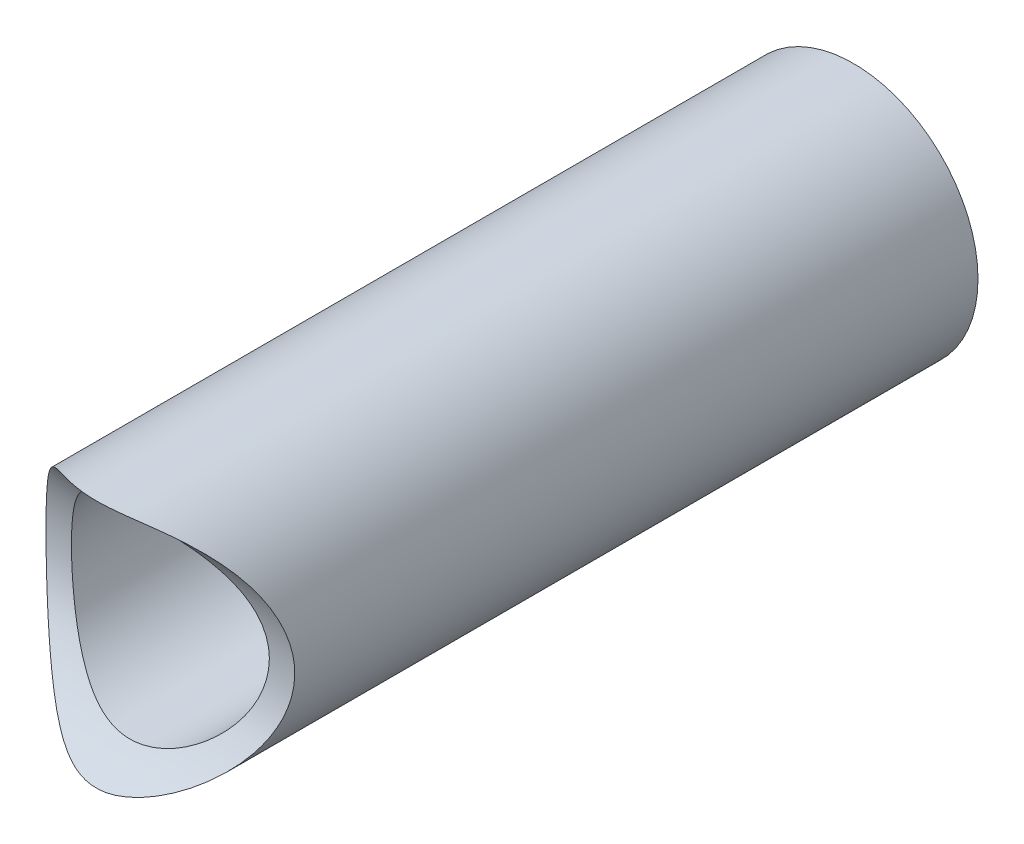
ISO-10303-21;
HEADER;
FILE_DESCRIPTION(('STEP AP214'),'2;1');
FILE_NAME('part.step','',(''),(''),'','','');
FILE_SCHEMA(('AUTOMOTIVE_DESIGN { 1 0 10303 214 1 1 1 1 }'));
ENDSEC;
DATA;
#1=APPLICATION_CONTEXT('core data for automotive mechanical design processes');
#2=APPLICATION_PROTOCOL_DEFINITION('international standard','automotive_design',2000,#1);
#3=PRODUCT_CONTEXT('',#1,'mechanical');
#4=PRODUCT('Part','Part','',(#3));
#5=PRODUCT_RELATED_PRODUCT_CATEGORY('part','',(#4));
#6=PRODUCT_DEFINITION_FORMATION('','',#4);
#7=PRODUCT_DEFINITION_CONTEXT('part definition',#1,'design');
#8=PRODUCT_DEFINITION('design','',#6,#7);
#9=PRODUCT_DEFINITION_SHAPE('','',#8);
#10=(LENGTH_UNIT() NAMED_UNIT(*) SI_UNIT(.MILLI.,.METRE.));
#11=(NAMED_UNIT(*) PLANE_ANGLE_UNIT() SI_UNIT($,.RADIAN.));
#12=(NAMED_UNIT(*) SI_UNIT($,.STERADIAN.) SOLID_ANGLE_UNIT());
#13=UNCERTAINTY_MEASURE_WITH_UNIT(LENGTH_MEASURE(1.E-05),#10,'distance_accuracy_value','');
#14=(GEOMETRIC_REPRESENTATION_CONTEXT(3) GLOBAL_UNCERTAINTY_ASSIGNED_CONTEXT((#13)) GLOBAL_UNIT_ASSIGNED_CONTEXT((#10,
#11,#12)) REPRESENTATION_CONTEXT('',''));
#15=CARTESIAN_POINT('',(0.,0.,0.));
#16=DIRECTION('',(0.,0.,1.));
#17=DIRECTION('',(1.,0.,0.));
#18=AXIS2_PLACEMENT_3D('',#15,#16,#17);
#19=CARTESIAN_POINT('',(-16.764,0.,55.5625));
#20=DIRECTION('',(1.,0.,0.));
#21=DIRECTION('',(0.,1.,0.));
#22=AXIS2_PLACEMENT_3D('',#19,#20,#21);
#23=CYLINDRICAL_SURFACE('',#22,19.05);
#24=CARTESIAN_POINT('',(-16.764,0.,36.5125));
#25=CARTESIAN_POINT('',(-16.7640054844861,0.39139730942897,36.5124945813317));
#26=CARTESIAN_POINT('',(-16.7502734230084,0.78273680027755,36.5245825700416));
#27=CARTESIAN_POINT('',(-16.6956257305327,1.56217551972862,36.5726461807048));
#28=CARTESIAN_POINT('',(-16.6547016279179,1.95027370034154,36.6086292471114));
#29=CARTESIAN_POINT('',(-16.5463873139127,2.72032341176663,36.703733673084));
#30=CARTESIAN_POINT('',(-16.4789660032711,3.10226716890006,36.7628822212361));
#31=CARTESIAN_POINT('',(-16.3188963039278,3.85668476922253,36.903033594525));
#32=CARTESIAN_POINT('',(-16.2262492809356,4.2291591238878,36.984035236542));
#33=CARTESIAN_POINT('',(-16.0179510137251,4.95987440751327,37.1656802004901));
#34=CARTESIAN_POINT('',(-15.9024545047754,5.31819261731891,37.2661913234364));
#35=CARTESIAN_POINT('',(-15.6497624921902,6.02131295287309,37.4853896260594));
#36=CARTESIAN_POINT('',(-15.5125671660242,6.36611518913684,37.6040766570793));
#37=CARTESIAN_POINT('',(-15.2182027200028,7.04084442938859,37.8577289562082));
#38=CARTESIAN_POINT('',(-15.0610336122564,7.37077144239454,37.9926942144487));
#39=CARTESIAN_POINT('',(-14.7283825839439,8.0148538849354,38.2769972470671));
#40=CARTESIAN_POINT('',(-14.5528966104928,8.32900580111868,38.4263382017156));
#41=CARTESIAN_POINT('',(-14.1135863944062,9.06003756388114,38.7980868612807));
#42=CARTESIAN_POINT('',(-13.8419655902768,9.46930460739496,39.0263080929029));
#43=CARTESIAN_POINT('',(-13.270074368657,10.2554025738446,39.5019754050165));
#44=CARTESIAN_POINT('',(-12.9697936052195,10.6322216893299,39.74942842195));
#45=CARTESIAN_POINT('',(-12.3428676026689,11.3540460202597,40.259433754209));
#46=CARTESIAN_POINT('',(-12.0161638044063,11.6989767289146,40.522019214675));
#47=CARTESIAN_POINT('',(-11.3392026544145,12.3562439428633,41.0571459104997));
#48=CARTESIAN_POINT('',(-10.9889484509778,12.668584790683,41.3296858129009));
#49=CARTESIAN_POINT('',(-10.258200717814,13.2675973415175,41.8860946867955));
#50=CARTESIAN_POINT('',(-9.87721216442799,13.5535550571456,42.170081019931));
#51=CARTESIAN_POINT('',(-9.09219677797624,14.0922096896172,42.7380982049038));
#52=CARTESIAN_POINT('',(-8.68816290234574,14.3448963600563,43.0221290436102));
#53=CARTESIAN_POINT('',(-7.85723173716265,14.8163227632379,43.5828118228584));
#54=CARTESIAN_POINT('',(-7.43037957276275,15.0351263885835,43.8594768163004));
#55=CARTESIAN_POINT('',(-6.55138478119362,15.4384203281427,44.3969213234689));
#56=CARTESIAN_POINT('',(-6.09926118947797,15.6229360281505,44.657712492744));
#57=CARTESIAN_POINT('',(-5.39455814231206,15.8743298028289,45.0301002190666));
#58=CARTESIAN_POINT('',(-5.15238434302998,15.9546446081769,45.1523487810798));
#59=CARTESIAN_POINT('',(-4.66030599367574,16.1052663768937,45.386925396429));
#60=CARTESIAN_POINT('',(-4.41040112573988,16.1755729281046,45.4992530411314));
#61=CARTESIAN_POINT('',(-3.64908065172765,16.3703821316077,45.8170135281076));
#62=CARTESIAN_POINT('',(-3.12500711959367,16.4791562521724,46.0038052022338));
#63=CARTESIAN_POINT('',(-2.3600033455141,16.5986397878643,46.2140836216776));
#64=CARTESIAN_POINT('',(-2.1307625558452,16.6296684210884,46.26951376082));
#65=CARTESIAN_POINT('',(-1.6680115163756,16.682432978121,46.364572242488));
#66=CARTESIAN_POINT('',(-1.43450346495192,16.7041735535718,46.4042084942326));
#67=CARTESIAN_POINT('',(-0.964776280329246,16.7378694582023,46.4659357368013));
#68=CARTESIAN_POINT('',(-0.728561178459716,16.7498377998946,46.4880500583138));
#69=CARTESIAN_POINT('',(-0.254815706410914,16.7637378658403,46.5137535849874));
#70=CARTESIAN_POINT('',(-0.0172853544773878,16.7656697289769,46.5173430464925));
#71=CARTESIAN_POINT('',(0.457388465501336,16.7594416549323,46.5058087967156));
#72=CARTESIAN_POINT('',(0.694531412615337,16.7512728790473,46.4906686958655));
#73=CARTESIAN_POINT('',(1.16640476395944,16.7250426372729,46.442401788368));
#74=CARTESIAN_POINT('',(1.40113509716281,16.7069808809817,46.4092744537177));
#75=CARTESIAN_POINT('',(1.86708039642655,16.6613506877042,46.3264773758986));
#76=CARTESIAN_POINT('',(2.09828904349684,16.6337668794688,46.2767808899562));
#77=CARTESIAN_POINT('',(2.55584952098467,16.5696332212917,46.1628178093404));
#78=CARTESIAN_POINT('',(2.78219955123602,16.533080108427,46.0985459129578));
#79=CARTESIAN_POINT('',(3.35762150815613,16.4282054728797,45.9171424132188));
#80=CARTESIAN_POINT('',(3.70267882895301,16.3536833556349,45.7908271082948));
#81=CARTESIAN_POINT('',(4.3787247075996,16.1857957600185,45.5151845493678));
#82=CARTESIAN_POINT('',(4.70970382853596,16.0924178759123,45.3658421605779));
#83=CARTESIAN_POINT('',(5.35919121739291,15.8879532572602,45.050081020631));
#84=CARTESIAN_POINT('',(5.6776518282396,15.7768057379897,44.8836043808783));
#85=CARTESIAN_POINT('',(6.30177053089732,15.5380505437266,44.5390967530644));
#86=CARTESIAN_POINT('',(6.6074299141519,15.4104445344629,44.3610669351806));
#87=CARTESIAN_POINT('',(7.1554149889794,15.1626495981367,44.0285549654064));
#88=CARTESIAN_POINT('',(7.3996060949168,15.0449472337159,43.875276233152));
#89=CARTESIAN_POINT('',(7.88025319681457,14.7988575509142,43.5651862794328));
#90=CARTESIAN_POINT('',(8.11670831545398,14.6704690264513,43.4083746606931));
#91=CARTESIAN_POINT('',(8.81513278520011,14.2693295043139,42.9347646575168));
#92=CARTESIAN_POINT('',(9.26601143824315,13.9806726387727,42.6148841651108));
#93=CARTESIAN_POINT('',(10.1384229841536,13.3615055691721,41.9768293736144));
#94=CARTESIAN_POINT('',(10.5599804439379,13.0310310731197,41.6586538574576));
#95=CARTESIAN_POINT('',(11.3731942648836,12.3276485328023,41.0313787827209));
#96=CARTESIAN_POINT('',(11.7648639518994,11.9547595864722,40.722275217573));
#97=CARTESIAN_POINT('',(12.4346001367814,11.2514174271904,40.185265753471));
#98=CARTESIAN_POINT('',(12.718906576194,10.9292480250436,39.9542658452051));
#99=CARTESIAN_POINT('',(13.2659128666432,10.258388523744,39.5053894151826));
#100=CARTESIAN_POINT('',(13.5286128327063,9.90969856579826,39.2875128235627));
#101=CARTESIAN_POINT('',(14.0297432602722,9.18647366244573,38.8686199459552));
#102=CARTESIAN_POINT('',(14.2682034680756,8.81197136435147,38.6675830494706));
#103=CARTESIAN_POINT('',(14.7184001231168,8.03746768578073,38.2856975944553));
#104=CARTESIAN_POINT('',(14.930142941795,7.63747241912669,38.1048442238429));
#105=CARTESIAN_POINT('',(15.2852740467478,6.89398710918225,37.8000728485269));
#106=CARTESIAN_POINT('',(15.4339330061349,6.55473665330571,37.6719360256148));
#107=CARTESIAN_POINT('',(15.7101704316789,5.86184923320539,37.433091806895));
#108=CARTESIAN_POINT('',(15.8377532736422,5.50821527432151,37.3223807933807));
#109=CARTESIAN_POINT('',(16.0699482096872,4.78864689145758,37.1204078509041));
#110=CARTESIAN_POINT('',(16.1745935235463,4.42273115308434,37.0291178008284));
#111=CARTESIAN_POINT('',(16.3594896175105,3.68036814061739,36.8675357165914));
#112=CARTESIAN_POINT('',(16.4397477841335,3.30392409319819,36.797237324469));
#113=CARTESIAN_POINT('',(16.5918605422337,2.44493943243533,36.6638504490648));
#114=CARTESIAN_POINT('',(16.6562405502888,1.96002022472188,36.6072701775727));
#115=CARTESIAN_POINT('',(16.7423107881715,0.983371098501145,36.5315948847026));
#116=CARTESIAN_POINT('',(16.7639931108561,0.491639935470647,36.5125068064692));
#117=CARTESIAN_POINT('',(16.7640054844861,-0.391397309428968,36.5124945813317));
#118=CARTESIAN_POINT('',(16.7502734230084,-0.78273680027755,36.5245825700416));
#119=CARTESIAN_POINT('',(16.6956257305327,-1.56217551972862,36.5726461807048));
#120=CARTESIAN_POINT('',(16.6547016279179,-1.95027370034154,36.6086292471114));
#121=CARTESIAN_POINT('',(16.5463873139127,-2.72032341176663,36.703733673084));
#122=CARTESIAN_POINT('',(16.4789660032711,-3.10226716890006,36.7628822212361));
#123=CARTESIAN_POINT('',(16.3188963039278,-3.85668476922253,36.903033594525));
#124=CARTESIAN_POINT('',(16.2262492809356,-4.2291591238878,36.9840352365421));
#125=CARTESIAN_POINT('',(16.0179510137251,-4.95987440751327,37.1656802004901));
#126=CARTESIAN_POINT('',(15.9024545047754,-5.31819261731891,37.2661913234365));
#127=CARTESIAN_POINT('',(15.6497624921902,-6.02131295287309,37.4853896260594));
#128=CARTESIAN_POINT('',(15.5125671660242,-6.36611518913684,37.6040766570793));
#129=CARTESIAN_POINT('',(15.2182027200028,-7.04084442938859,37.8577289562082));
#130=CARTESIAN_POINT('',(15.0610336122564,-7.37077144239454,37.9926942144487));
#131=CARTESIAN_POINT('',(14.7283825839439,-8.01485388493539,38.2769972470671));
#132=CARTESIAN_POINT('',(14.5528966104928,-8.32900580111867,38.4263382017156));
#133=CARTESIAN_POINT('',(14.1135863944062,-9.06003756388114,38.7980868612807));
#134=CARTESIAN_POINT('',(13.8419655902768,-9.46930460739496,39.026308092903));
#135=CARTESIAN_POINT('',(13.270074368657,-10.2554025738446,39.5019754050165));
#136=CARTESIAN_POINT('',(12.9697936052195,-10.6322216893299,39.74942842195));
#137=CARTESIAN_POINT('',(12.3428676026689,-11.3540460202597,40.259433754209));
#138=CARTESIAN_POINT('',(12.0161638044063,-11.6989767289146,40.522019214675));
#139=CARTESIAN_POINT('',(11.3392026544145,-12.3562439428633,41.0571459104997));
#140=CARTESIAN_POINT('',(10.9889484509778,-12.668584790683,41.3296858129009));
#141=CARTESIAN_POINT('',(10.258200717814,-13.2675973415174,41.8860946867955));
#142=CARTESIAN_POINT('',(9.87721216442798,-13.5535550571456,42.170081019931));
#143=CARTESIAN_POINT('',(9.09219677797624,-14.0922096896172,42.7380982049038));
#144=CARTESIAN_POINT('',(8.68816290234574,-14.3448963600564,43.0221290436102));
#145=CARTESIAN_POINT('',(7.85723173716264,-14.8163227632379,43.5828118228584));
#146=CARTESIAN_POINT('',(7.43037957276274,-15.0351263885835,43.8594768163004));
#147=CARTESIAN_POINT('',(6.55138478119362,-15.4384203281427,44.3969213234689));
#148=CARTESIAN_POINT('',(6.09926118947798,-15.6229360281505,44.657712492744));
#149=CARTESIAN_POINT('',(5.39455814231207,-15.8743298028289,45.0301002190666));
#150=CARTESIAN_POINT('',(5.15238434302999,-15.9546446081769,45.1523487810798));
#151=CARTESIAN_POINT('',(4.66030599367575,-16.1052663768937,45.386925396429));
#152=CARTESIAN_POINT('',(4.41040112573989,-16.1755729281046,45.4992530411314));
#153=CARTESIAN_POINT('',(3.64908065172766,-16.3703821316077,45.8170135281077));
#154=CARTESIAN_POINT('',(3.12500711959367,-16.4791562521724,46.0038052022338));
#155=CARTESIAN_POINT('',(2.36000334551411,-16.5986397878643,46.2140836216776));
#156=CARTESIAN_POINT('',(2.13076255584521,-16.6296684210884,46.26951376082));
#157=CARTESIAN_POINT('',(1.66801151637561,-16.682432978121,46.364572242488));
#158=CARTESIAN_POINT('',(1.43450346495193,-16.7041735535718,46.4042084942326));
#159=CARTESIAN_POINT('',(0.964776280329263,-16.7378694582023,46.4659357368013));
#160=CARTESIAN_POINT('',(0.72856117845973,-16.7498377998946,46.4880500583138));
#161=CARTESIAN_POINT('',(0.254815706410926,-16.7637378658403,46.5137535849874));
#162=CARTESIAN_POINT('',(0.0172853544773994,-16.7656697289769,46.5173430464926));
#163=CARTESIAN_POINT('',(-0.457388465501328,-16.7594416549323,46.5058087967156));
#164=CARTESIAN_POINT('',(-0.694531412615333,-16.7512728790473,46.4906686958655));
#165=CARTESIAN_POINT('',(-1.16640476395944,-16.7250426372729,46.442401788368));
#166=CARTESIAN_POINT('',(-1.4011350971628,-16.7069808809817,46.4092744537177));
#167=CARTESIAN_POINT('',(-1.86708039642654,-16.6613506877042,46.3264773758987));
#168=CARTESIAN_POINT('',(-2.09828904349684,-16.6337668794688,46.2767808899563));
#169=CARTESIAN_POINT('',(-2.55584952098466,-16.5696332212917,46.1628178093404));
#170=CARTESIAN_POINT('',(-2.78219955123601,-16.533080108427,46.0985459129579));
#171=CARTESIAN_POINT('',(-3.35762150815611,-16.4282054728797,45.9171424132188));
#172=CARTESIAN_POINT('',(-3.702678828953,-16.3536833556349,45.7908271082949));
#173=CARTESIAN_POINT('',(-4.37872470759958,-16.1857957600185,45.5151845493678));
#174=CARTESIAN_POINT('',(-4.70970382853594,-16.0924178759123,45.3658421605779));
#175=CARTESIAN_POINT('',(-5.35919121739289,-15.8879532572602,45.0500810206311));
#176=CARTESIAN_POINT('',(-5.67765182823959,-15.7768057379897,44.8836043808783));
#177=CARTESIAN_POINT('',(-6.30177053089731,-15.5380505437266,44.5390967530644));
#178=CARTESIAN_POINT('',(-6.60742991415188,-15.4104445344629,44.3610669351806));
#179=CARTESIAN_POINT('',(-7.15541498897938,-15.1626495981368,44.0285549654064));
#180=CARTESIAN_POINT('',(-7.39960609491679,-15.0449472337159,43.875276233152));
#181=CARTESIAN_POINT('',(-7.88025319681455,-14.7988575509143,43.5651862794328));
#182=CARTESIAN_POINT('',(-8.11670831545397,-14.6704690264513,43.4083746606931));
#183=CARTESIAN_POINT('',(-8.81513278520009,-14.2693295043139,42.9347646575168));
#184=CARTESIAN_POINT('',(-9.26601143824314,-13.9806726387727,42.6148841651108));
#185=CARTESIAN_POINT('',(-10.1384229841536,-13.3615055691721,41.9768293736145));
#186=CARTESIAN_POINT('',(-10.5599804439379,-13.0310310731197,41.6586538574576));
#187=CARTESIAN_POINT('',(-11.3731942648836,-12.3276485328023,41.0313787827209));
#188=CARTESIAN_POINT('',(-11.7648639518994,-11.9547595864722,40.722275217573));
#189=CARTESIAN_POINT('',(-12.4346001367813,-11.2514174271905,40.185265753471));
#190=CARTESIAN_POINT('',(-12.718906576194,-10.9292480250436,39.9542658452052));
#191=CARTESIAN_POINT('',(-13.2659128666432,-10.258388523744,39.5053894151826));
#192=CARTESIAN_POINT('',(-13.5286128327063,-9.90969856579828,39.2875128235627));
#193=CARTESIAN_POINT('',(-14.0297432602722,-9.18647366244574,38.8686199459552));
#194=CARTESIAN_POINT('',(-14.2682034680756,-8.81197136435149,38.6675830494707));
#195=CARTESIAN_POINT('',(-14.7184001231168,-8.03746768578074,38.2856975944554));
#196=CARTESIAN_POINT('',(-14.930142941795,-7.63747241912671,38.1048442238429));
#197=CARTESIAN_POINT('',(-15.2852740467478,-6.89398710918227,37.8000728485269));
#198=CARTESIAN_POINT('',(-15.4339330061349,-6.55473665330573,37.6719360256148));
#199=CARTESIAN_POINT('',(-15.7101704316789,-5.8618492332054,37.433091806895));
#200=CARTESIAN_POINT('',(-15.8377532736422,-5.50821527432152,37.3223807933807));
#201=CARTESIAN_POINT('',(-16.0699482096872,-4.7886468914576,37.1204078509041));
#202=CARTESIAN_POINT('',(-16.1745935235463,-4.42273115308435,37.0291178008284));
#203=CARTESIAN_POINT('',(-16.3594896175105,-3.68036814061741,36.8675357165914));
#204=CARTESIAN_POINT('',(-16.4397477841335,-3.30392409319821,36.797237324469));
#205=CARTESIAN_POINT('',(-16.5918605422337,-2.44493943243535,36.6638504490648));
#206=CARTESIAN_POINT('',(-16.6562405502888,-1.96002022472189,36.6072701775727));
#207=CARTESIAN_POINT('',(-16.7423107881715,-0.983371098501147,36.5315948847026));
#208=CARTESIAN_POINT('',(-16.7639931108561,-0.491639935470646,36.5125068064692));
#209=CARTESIAN_POINT('',(-16.764,0.,36.5125));
#210=B_SPLINE_CURVE_WITH_KNOTS('',3,(#24,#25,#26,#27,#28,#29,#30,#31,#32,#33,#34,#35,#36,#37,
#38,#39,#40,#41,#42,#43,#44,#45,#46,#47,#48,#49,#50,#51,#52,#53,#54,#55,#56,#57,#58,#59,#60,#61,
#62,#63,#64,#65,#66,#67,#68,#69,#70,#71,#72,#73,#74,#75,#76,#77,#78,#79,#80,#81,#82,#83,#84,#85,
#86,#87,#88,#89,#90,#91,#92,#93,#94,#95,#96,#97,#98,#99,#100,#101,#102,#103,#104,#105,#106,#107,
#108,#109,#110,#111,#112,#113,#114,#115,#116,#117,#118,#119,#120,#121,#122,#123,#124,#125,#126,
#127,#128,#129,#130,#131,#132,#133,#134,#135,#136,#137,#138,#139,#140,#141,#142,#143,#144,#145,
#146,#147,#148,#149,#150,#151,#152,#153,#154,#155,#156,#157,#158,#159,#160,#161,#162,#163,#164,
#165,#166,#167,#168,#169,#170,#171,#172,#173,#174,#175,#176,#177,#178,#179,#180,#181,#182,#183,
#184,#185,#186,#187,#188,#189,#190,#191,#192,#193,#194,#195,#196,#197,#198,#199,#200,#201,#202,
#203,#204,#205,#206,#207,#208,#209),.UNSPECIFIED.,.T.,.F.,(4,2,2,2,2,2,2,2,2,2,2,2,2,2,2,2,2,2,
2,2,2,2,2,2,2,2,2,2,2,2,2,2,2,2,2,2,2,2,2,2,2,2,2,2,2,2,2,2,2,2,2,2,2,2,2,2,2,2,2,2,2,2,2,2,2,2,
2,2,2,2,2,2,2,2,2,2,2,2,2,2,2,2,2,2,2,2,2,2,2,2,2,2,4),(0.,1.17366938123894,2.34770458797881,
3.523121871657,4.69847553138196,5.86612660471153,7.03376812858978,8.20140894458896,
9.36930866876286,10.9918195004091,12.614918272965,14.2417183032403,15.8683012884927,
17.5305903747246,19.1933902007111,20.8530153001715,22.5114067222628,23.3597307967524,
24.2080897966516,25.9010449101967,26.6141008166743,27.3267991908789,28.0385469952419,
28.7502849505304,29.4626461629635,30.1750282874027,30.8885658150781,31.6023633047983,
32.7252553830502,33.8488886646121,34.9764512122882,36.1038997311761,37.0378230516306,
37.9718519216566,39.8404749405956,41.7075129787961,43.5737136498739,45.0359915995116,
46.498261763895,47.9587152434052,49.4188197797639,50.5934966901756,51.7679294077689,
52.9406498212808,54.113014679688,55.5870051658314,57.0612685931861,58.2349379744251,
59.408973181165,60.5843904648431,61.7597441245681,62.9273951978977,64.0950367217759,
65.2626775377751,66.430577261949,68.0530880935953,69.6761868661511,71.3029868964264,
72.9295698816788,74.5918589679107,76.2546587938972,77.9142838933576,79.5726753154489,
80.4209993899385,81.2693583898378,82.9623135033828,83.6753694098605,84.3880677840651,
85.099815588428,85.8115535437166,86.5239147561497,87.2362968805888,87.9498344082643,
88.6636318979845,89.7865239762363,90.9101572577982,92.0377198054744,93.1651683243623,
94.0990916448167,95.0331205148428,96.9017435337817,98.7687815719823,100.63498224306,
102.097260192698,103.559530357081,105.019983836591,106.48008837295,107.654765283362,
108.829198000955,110.001918414467,111.174283272874,112.648273759018,114.122537186372),.UNSPECIFIED.);
#211=CARTESIAN_POINT('',(-16.764,0.,36.5125));
#212=VERTEX_POINT('',#211);
#213=EDGE_CURVE('E23',#212,#212,#210,.T.);
#214=ORIENTED_EDGE('',*,*,#213,.F.);
#215=EDGE_LOOP('',(#214));
#216=FACE_BOUND('',#215,.T.);
#217=CARTESIAN_POINT('',(13.335,0.,36.5125));
#218=CARTESIAN_POINT('',(13.3349998310996,-0.331214006662135,36.5125001606869));
#219=CARTESIAN_POINT('',(13.3226427833964,-0.662430379972625,36.5211561860425));
#220=CARTESIAN_POINT('',(13.2734073009387,-1.32226605422439,36.5555721043265));
#221=CARTESIAN_POINT('',(13.2365188451218,-1.65088423827268,36.5813389870213));
#222=CARTESIAN_POINT('',(13.1387220509647,-2.30329936426253,36.6494077239953));
#223=CARTESIAN_POINT('',(13.0777765314928,-2.62708803426037,36.6917351723782));
#224=CARTESIAN_POINT('',(12.9327849510489,-3.26694211170769,36.7919257356523));
#225=CARTESIAN_POINT('',(12.8487409067431,-3.58300819077254,36.8497874942772));
#226=CARTESIAN_POINT('',(12.6592170975991,-4.20371008478648,36.9794081656126));
#227=CARTESIAN_POINT('',(12.5538580546709,-4.50839930583791,37.0510887096387));
#228=CARTESIAN_POINT('',(12.3226717804494,-5.10654548667596,37.2070855979078));
#229=CARTESIAN_POINT('',(12.1968441695972,-5.40000223804853,37.291402176465));
#230=CARTESIAN_POINT('',(11.9260705808903,-5.97426186786242,37.4710330613262));
#231=CARTESIAN_POINT('',(11.781133057736,-6.25507026896431,37.5663425017931));
#232=CARTESIAN_POINT('',(11.4732920140314,-6.80328393844191,37.766348472144));
#233=CARTESIAN_POINT('',(11.3103818256876,-7.07068417856313,37.8710484831832));
#234=CARTESIAN_POINT('',(10.9526684852804,-7.61421443705744,38.097666582422));
#235=CARTESIAN_POINT('',(10.756319601426,-7.88903315496674,38.2202887827578));
#236=CARTESIAN_POINT('',(10.3450726659631,-8.42109082920582,38.4723157788924));
#237=CARTESIAN_POINT('',(10.1301740190812,-8.67832922089698,38.6017207923036));
#238=CARTESIAN_POINT('',(9.68257063367653,-9.17507520534563,38.8652051308582));
#239=CARTESIAN_POINT('',(9.44983864279871,-9.41455451438904,38.9992914324668));
#240=CARTESIAN_POINT('',(8.96779865598274,-9.87480878074935,39.2694996616376));
#241=CARTESIAN_POINT('',(8.71849408369825,-10.0955875800185,39.405621164281));
#242=CARTESIAN_POINT('',(8.15852830623948,-10.5552832588468,39.7013607720932));
#243=CARTESIAN_POINT('',(7.84479901762021,-10.7905350661877,39.8608901803219));
#244=CARTESIAN_POINT('',(7.19596479816822,-11.2336408287707,40.1747921014021));
#245=CARTESIAN_POINT('',(6.8608543535791,-11.4414876741207,40.3291632682841));
#246=CARTESIAN_POINT('',(6.17042176409874,-11.8281221846384,40.6273886918586));
#247=CARTESIAN_POINT('',(5.81512641249453,-12.0069472101947,40.7712563364904));
#248=CARTESIAN_POINT('',(5.08485125467672,-12.3339522599415,41.0428137400705));
#249=CARTESIAN_POINT('',(4.70988194714212,-12.4821484243073,41.1705120058168));
#250=CARTESIAN_POINT('',(4.06150662275521,-12.7045073996557,41.3669847158969));
#251=CARTESIAN_POINT('',(3.79285973637347,-12.7873501324856,41.4417212080728));
#252=CARTESIAN_POINT('',(3.24783219070956,-12.9365212172016,41.578253568734));
#253=CARTESIAN_POINT('',(2.97145386216519,-13.0028544876395,41.6400532905094));
#254=CARTESIAN_POINT('',(2.41260904071702,-13.1180330721688,41.7485224079218));
#255=CARTESIAN_POINT('',(2.13015314602492,-13.1669065675404,41.7952161740018));
#256=CARTESIAN_POINT('',(1.56041079404798,-13.2465111932256,41.8717911422238));
#257=CARTESIAN_POINT('',(1.27312434761947,-13.2772423643074,41.9016723821456));
#258=CARTESIAN_POINT('',(0.694155913978656,-13.3201016958579,41.9434579490931));
#259=CARTESIAN_POINT('',(0.40245807703037,-13.3321205680373,41.9552566597636));
#260=CARTESIAN_POINT('',(-0.181251300365104,-13.3369620476428,41.9600018399201));
#261=CARTESIAN_POINT('',(-0.473262839649987,-13.3297847259497,41.9529483790164));
#262=CARTESIAN_POINT('',(-1.05531063509338,-13.2963746511409,41.9203060473015));
#263=CARTESIAN_POINT('',(-1.3453456004487,-13.2701304631805,41.8947060537276));
#264=CARTESIAN_POINT('',(-1.92102454000492,-13.1990917790176,41.8260921894121));
#265=CARTESIAN_POINT('',(-2.20666842282074,-13.1542968972877,41.7830779567616));
#266=CARTESIAN_POINT('',(-2.75293211401949,-13.0505046901703,41.6847637992091));
#267=CARTESIAN_POINT('',(-3.01395316933309,-12.9926494008912,41.6304706275814));
#268=CARTESIAN_POINT('',(-3.52949877768456,-12.862178710381,41.5099289044254));
#269=CARTESIAN_POINT('',(-3.78402090501314,-12.7895578860386,41.4436759612969));
#270=CARTESIAN_POINT('',(-4.53671445638378,-12.5505957500511,41.2296465621945));
#271=CARTESIAN_POINT('',(-5.02404498698402,-12.363148575814,41.0665934016235));
#272=CARTESIAN_POINT('',(-5.85475066123838,-11.9875223799871,40.755522913561));
#273=CARTESIAN_POINT('',(-6.20509107438044,-11.8098162886531,40.6129415437968));
#274=CARTESIAN_POINT('',(-6.88584733133273,-11.4262813094221,40.3177913113794));
#275=CARTESIAN_POINT('',(-7.21625495061505,-11.2204409258094,40.165218379501));
#276=CARTESIAN_POINT('',(-7.85682760653754,-10.7816290421719,39.8548154988196));
#277=CARTESIAN_POINT('',(-8.1669558801132,-10.5486102900442,39.6969767454439));
#278=CARTESIAN_POINT('',(-8.7655595028778,-10.0567002588419,39.3806961086577));
#279=CARTESIAN_POINT('',(-9.05403765086052,-9.79781233409636,39.2222543059977));
#280=CARTESIAN_POINT('',(-9.61159741992512,-9.25167554501496,38.9068819301783));
#281=CARTESIAN_POINT('',(-9.8804082345447,-8.96412657715668,38.7499916040065));
#282=CARTESIAN_POINT('',(-10.3933081084284,-8.36403909727233,38.4435381307309));
#283=CARTESIAN_POINT('',(-10.6373947046992,-8.05149810111279,38.2939757143884));
#284=CARTESIAN_POINT('',(-11.0985135680546,-7.40292495288257,38.0061652287347));
#285=CARTESIAN_POINT('',(-11.3155856374938,-7.06692852739921,37.8679006193423));
#286=CARTESIAN_POINT('',(-11.7207137247781,-6.37248409984463,37.6061219984507));
#287=CARTESIAN_POINT('',(-11.9087791706917,-6.01404344634029,37.4826031970606));
#288=CARTESIAN_POINT('',(-12.2153076329885,-5.35808779881927,37.2790658151983));
#289=CARTESIAN_POINT('',(-12.339973797294,-5.06456907552826,37.1954612791157));
#290=CARTESIAN_POINT('',(-12.5688335095926,-4.46644443655993,37.0409255529209));
#291=CARTESIAN_POINT('',(-12.6730312027857,-4.1618407806033,36.969991797033));
#292=CARTESIAN_POINT('',(-12.8595568947654,-3.54373158148091,36.8423541169374));
#293=CARTESIAN_POINT('',(-12.9419256853341,-3.23024387152182,36.7856236620777));
#294=CARTESIAN_POINT('',(-13.0839230460293,-2.59591248066319,36.6874719745261));
#295=CARTESIAN_POINT('',(-13.1435602868023,-2.2750716541173,36.6460449047485));
#296=CARTESIAN_POINT('',(-13.2390185821769,-1.62985280601078,36.5795940483614));
#297=CARTESIAN_POINT('',(-13.2749587623445,-1.30550093902369,36.5544882236335));
#298=CARTESIAN_POINT('',(-13.3229520975901,-0.65410052339235,36.5209393462468));
#299=CARTESIAN_POINT('',(-13.3350001667777,-0.327051415463977,36.5124998413326));
#300=CARTESIAN_POINT('',(-13.3349998310996,0.331214006662137,36.5125001606869));
#301=CARTESIAN_POINT('',(-13.3226427833964,0.662430379972627,36.5211561860425));
#302=CARTESIAN_POINT('',(-13.2734073009387,1.32226605422439,36.5555721043265));
#303=CARTESIAN_POINT('',(-13.2365188451218,1.65088423827268,36.5813389870213));
#304=CARTESIAN_POINT('',(-13.1387220509647,2.30329936426253,36.6494077239953));
#305=CARTESIAN_POINT('',(-13.0777765314928,2.62708803426038,36.6917351723782));
#306=CARTESIAN_POINT('',(-12.9327849510489,3.2669421117077,36.7919257356523));
#307=CARTESIAN_POINT('',(-12.8487409067431,3.58300819077254,36.8497874942772));
#308=CARTESIAN_POINT('',(-12.6592170975991,4.20371008478648,36.9794081656126));
#309=CARTESIAN_POINT('',(-12.5538580546709,4.50839930583792,37.0510887096387));
#310=CARTESIAN_POINT('',(-12.3226717804494,5.10654548667597,37.2070855979078));
#311=CARTESIAN_POINT('',(-12.1968441695972,5.40000223804854,37.291402176465));
#312=CARTESIAN_POINT('',(-11.9260705808903,5.97426186786242,37.4710330613262));
#313=CARTESIAN_POINT('',(-11.781133057736,6.25507026896431,37.5663425017931));
#314=CARTESIAN_POINT('',(-11.4732920140314,6.80328393844191,37.766348472144));
#315=CARTESIAN_POINT('',(-11.3103818256876,7.07068417856313,37.8710484831832));
#316=CARTESIAN_POINT('',(-10.9526684852804,7.61421443705744,38.097666582422));
#317=CARTESIAN_POINT('',(-10.756319601426,7.88903315496674,38.2202887827578));
#318=CARTESIAN_POINT('',(-10.3450726659631,8.42109082920582,38.4723157788924));
#319=CARTESIAN_POINT('',(-10.1301740190812,8.67832922089699,38.6017207923036));
#320=CARTESIAN_POINT('',(-9.68257063367653,9.17507520534564,38.8652051308582));
#321=CARTESIAN_POINT('',(-9.4498386427987,9.41455451438905,38.9992914324668));
#322=CARTESIAN_POINT('',(-8.96779865598274,9.87480878074935,39.2694996616376));
#323=CARTESIAN_POINT('',(-8.71849408369824,10.0955875800185,39.405621164281));
#324=CARTESIAN_POINT('',(-8.15852830623948,10.5552832588468,39.7013607720932));
#325=CARTESIAN_POINT('',(-7.8447990176202,10.7905350661877,39.8608901803219));
#326=CARTESIAN_POINT('',(-7.19596479816821,11.2336408287707,40.1747921014021));
#327=CARTESIAN_POINT('',(-6.86085435357909,11.4414876741207,40.3291632682841));
#328=CARTESIAN_POINT('',(-6.17042176409874,11.8281221846384,40.6273886918586));
#329=CARTESIAN_POINT('',(-5.81512641249452,12.0069472101947,40.7712563364904));
#330=CARTESIAN_POINT('',(-5.08485125467672,12.3339522599415,41.0428137400705));
#331=CARTESIAN_POINT('',(-4.70988194714212,12.4821484243073,41.1705120058168));
#332=CARTESIAN_POINT('',(-4.06150662275521,12.7045073996557,41.3669847158969));
#333=CARTESIAN_POINT('',(-3.79285973637346,12.7873501324856,41.4417212080728));
#334=CARTESIAN_POINT('',(-3.24783219070955,12.9365212172016,41.578253568734));
#335=CARTESIAN_POINT('',(-2.97145386216519,13.0028544876395,41.6400532905093));
#336=CARTESIAN_POINT('',(-2.41260904071702,13.1180330721688,41.7485224079218));
#337=CARTESIAN_POINT('',(-2.13015314602492,13.1669065675404,41.7952161740017));
#338=CARTESIAN_POINT('',(-1.56041079404798,13.2465111932256,41.8717911422237));
#339=CARTESIAN_POINT('',(-1.27312434761947,13.2772423643074,41.9016723821456));
#340=CARTESIAN_POINT('',(-0.694155913978652,13.3201016958579,41.9434579490931));
#341=CARTESIAN_POINT('',(-0.402458077030366,13.3321205680373,41.9552566597636));
#342=CARTESIAN_POINT('',(0.181251300365107,13.3369620476428,41.9600018399201));
#343=CARTESIAN_POINT('',(0.47326283964999,13.3297847259497,41.9529483790164));
#344=CARTESIAN_POINT('',(1.05531063509338,13.2963746511409,41.9203060473015));
#345=CARTESIAN_POINT('',(1.34534560044871,13.2701304631805,41.8947060537276));
#346=CARTESIAN_POINT('',(1.92102454000493,13.1990917790176,41.8260921894121));
#347=CARTESIAN_POINT('',(2.20666842282075,13.1542968972877,41.7830779567616));
#348=CARTESIAN_POINT('',(2.75293211401949,13.0505046901703,41.6847637992091));
#349=CARTESIAN_POINT('',(3.0139531693331,12.9926494008911,41.6304706275814));
#350=CARTESIAN_POINT('',(3.52949877768457,12.862178710381,41.5099289044254));
#351=CARTESIAN_POINT('',(3.78402090501315,12.7895578860386,41.4436759612969));
#352=CARTESIAN_POINT('',(4.53671445638379,12.5505957500511,41.2296465621944));
#353=CARTESIAN_POINT('',(5.02404498698403,12.363148575814,41.0665934016235));
#354=CARTESIAN_POINT('',(5.85475066123838,11.9875223799871,40.755522913561));
#355=CARTESIAN_POINT('',(6.20509107438045,11.8098162886531,40.6129415437968));
#356=CARTESIAN_POINT('',(6.88584733133274,11.4262813094221,40.3177913113794));
#357=CARTESIAN_POINT('',(7.21625495061506,11.2204409258094,40.165218379501));
#358=CARTESIAN_POINT('',(7.85682760653754,10.7816290421719,39.8548154988196));
#359=CARTESIAN_POINT('',(8.1669558801132,10.5486102900442,39.6969767454439));
#360=CARTESIAN_POINT('',(8.7655595028778,10.0567002588418,39.3806961086577));
#361=CARTESIAN_POINT('',(9.05403765086053,9.79781233409636,39.2222543059977));
#362=CARTESIAN_POINT('',(9.61159741992512,9.25167554501496,38.9068819301783));
#363=CARTESIAN_POINT('',(9.8804082345447,8.96412657715668,38.7499916040065));
#364=CARTESIAN_POINT('',(10.3933081084284,8.36403909727233,38.4435381307309));
#365=CARTESIAN_POINT('',(10.6373947046992,8.05149810111279,38.2939757143884));
#366=CARTESIAN_POINT('',(11.0985135680546,7.40292495288257,38.0061652287347));
#367=CARTESIAN_POINT('',(11.3155856374938,7.0669285273992,37.8679006193423));
#368=CARTESIAN_POINT('',(11.7207137247781,6.37248409984463,37.6061219984507));
#369=CARTESIAN_POINT('',(11.9087791706917,6.01404344634029,37.4826031970606));
#370=CARTESIAN_POINT('',(12.2153076329885,5.35808779881927,37.2790658151983));
#371=CARTESIAN_POINT('',(12.339973797294,5.06456907552825,37.1954612791157));
#372=CARTESIAN_POINT('',(12.5688335095926,4.46644443655992,37.0409255529209));
#373=CARTESIAN_POINT('',(12.6730312027857,4.16184078060329,36.969991797033));
#374=CARTESIAN_POINT('',(12.8595568947654,3.5437315814809,36.8423541169373));
#375=CARTESIAN_POINT('',(12.9419256853341,3.23024387152181,36.7856236620777));
#376=CARTESIAN_POINT('',(13.0839230460293,2.59591248066319,36.6874719745261));
#377=CARTESIAN_POINT('',(13.1435602868023,2.27507165411729,36.6460449047485));
#378=CARTESIAN_POINT('',(13.2390185821769,1.62985280601077,36.5795940483614));
#379=CARTESIAN_POINT('',(13.2749587623445,1.30550093902369,36.5544882236335));
#380=CARTESIAN_POINT('',(13.3229520975901,0.654100523392352,36.5209393462468));
#381=CARTESIAN_POINT('',(13.3350001667777,0.32705141546398,36.5124998413326));
#382=CARTESIAN_POINT('',(13.335,0.,36.5125));
#383=B_SPLINE_CURVE_WITH_KNOTS('',3,(#217,#218,#219,#220,#221,#222,#223,#224,#225,#226,#227,
#228,#229,#230,#231,#232,#233,#234,#235,#236,#237,#238,#239,#240,#241,#242,#243,#244,#245,#246,
#247,#248,#249,#250,#251,#252,#253,#254,#255,#256,#257,#258,#259,#260,#261,#262,#263,#264,#265,
#266,#267,#268,#269,#270,#271,#272,#273,#274,#275,#276,#277,#278,#279,#280,#281,#282,#283,#284,
#285,#286,#287,#288,#289,#290,#291,#292,#293,#294,#295,#296,#297,#298,#299,#300,#301,#302,#303,
#304,#305,#306,#307,#308,#309,#310,#311,#312,#313,#314,#315,#316,#317,#318,#319,#320,#321,#322,
#323,#324,#325,#326,#327,#328,#329,#330,#331,#332,#333,#334,#335,#336,#337,#338,#339,#340,#341,
#342,#343,#344,#345,#346,#347,#348,#349,#350,#351,#352,#353,#354,#355,#356,#357,#358,#359,#360,
#361,#362,#363,#364,#365,#366,#367,#368,#369,#370,#371,#372,#373,#374,#375,#376,#377,#378,#379,
#380,#381,#382),.UNSPECIFIED.,.T.,.F.,(4,2,2,2,2,2,2,2,2,2,2,2,2,2,2,2,2,2,2,2,2,2,2,2,2,2,2,2,
2,2,2,2,2,2,2,2,2,2,2,2,2,2,2,2,2,2,2,2,2,2,2,2,2,2,2,2,2,2,2,2,2,2,2,2,2,2,2,2,2,2,2,2,2,2,2,2,
2,2,2,2,2,2,4),(0.,0.993305965638366,1.98701794549139,2.98227179751517,3.97743878435657,
4.96711975302053,5.95681907593313,6.94608199139874,7.93571316192537,9.01265801943843,
10.0896374496408,11.1682968313345,12.2467340661055,13.5153113006136,14.784217007542,
16.0514760417461,17.3180655692068,18.1899975736358,19.0616694974966,19.931928057489,
20.8021846618963,21.6775051421358,22.5528223903156,23.4286650204678,24.3045258536227,
25.1221645584981,25.9401041113804,27.5758847763422,28.8281940080115,30.0810164734656,
31.3360504989802,32.5909220010205,33.8606851943665,35.1305747556648,36.3985705752236,
37.6661533836148,38.6541962891616,39.642038893116,40.6280222817397,41.6136292028948,
42.5942428984856,43.5750653139525,44.5683712795909,45.5620832594439,46.5573371114677,
47.5525040983091,48.542185066973,49.5318843898856,50.5211473053512,51.5107784758779,
52.5877233333909,53.6647027635933,54.743362145287,55.8217993800581,57.0903766145661,
58.3592823214945,59.6265413556986,60.8931308831593,61.7650628875883,62.6367348114491,
63.5069933714416,64.3772499758488,65.2525704560883,66.1278877042681,67.0037303344203,
67.8795911675752,68.6972298724507,69.5151694253329,71.1509500902947,72.403259321964,
73.6560817874181,74.9111158129327,76.1659873149731,77.435750508319,78.7056400696173,
79.9736358891761,81.2412186975673,82.2292616031141,83.2171042070685,84.2030875956923,
85.1886945168473,86.1693082124381,87.150130627905),.UNSPECIFIED.);
#384=CARTESIAN_POINT('',(13.335,0.,36.5125));
#385=VERTEX_POINT('',#384);
#386=EDGE_CURVE('E9',#385,#385,#383,.T.);
#387=ORIENTED_EDGE('',*,*,#386,.T.);
#388=EDGE_LOOP('',(#387));
#389=FACE_BOUND('',#388,.T.);
#390=ADVANCED_FACE('F14',(#216,#389),#23,.F.);
#391=CARTESIAN_POINT('',(0.,0.,55.5625));
#392=DIRECTION('',(0.,0.,-1.));
#393=DIRECTION('',(0.,-1.,0.));
#394=AXIS2_PLACEMENT_3D('',#391,#392,#393);
#395=CYLINDRICAL_SURFACE('',#394,13.335);
#396=ORIENTED_EDGE('',*,*,#386,.F.);
#397=EDGE_LOOP('',(#396));
#398=FACE_BOUND('',#397,.T.);
#399=CARTESIAN_POINT('',(0.,0.,-55.5625));
#400=DIRECTION('',(0.,0.,1.));
#401=DIRECTION('',(1.,0.,0.));
#402=AXIS2_PLACEMENT_3D('',#399,#400,#401);
#403=CIRCLE('',#402,13.335);
#404=CARTESIAN_POINT('',(13.335,0.,-55.5625));
#405=VERTEX_POINT('',#404);
#406=EDGE_CURVE('E19',#405,#405,#403,.T.);
#407=ORIENTED_EDGE('',*,*,#406,.F.);
#408=EDGE_LOOP('',(#407));
#409=FACE_BOUND('',#408,.T.);
#410=ADVANCED_FACE('F36',(#398,#409),#395,.F.);
#411=CARTESIAN_POINT('',(0.,0.,55.5625));
#412=DIRECTION('',(0.,0.,-1.));
#413=DIRECTION('',(0.,-1.,0.));
#414=AXIS2_PLACEMENT_3D('',#411,#412,#413);
#415=CYLINDRICAL_SURFACE('',#414,16.764);
#416=ORIENTED_EDGE('',*,*,#213,.T.);
#417=EDGE_LOOP('',(#416));
#418=FACE_BOUND('',#417,.T.);
#419=CARTESIAN_POINT('',(0.,0.,-55.5625));
#420=DIRECTION('',(0.,0.,1.));
#421=DIRECTION('',(1.,0.,0.));
#422=AXIS2_PLACEMENT_3D('',#419,#420,#421);
#423=CIRCLE('',#422,16.764);
#424=CARTESIAN_POINT('',(16.764,0.,-55.5625));
#425=VERTEX_POINT('',#424);
#426=EDGE_CURVE('E28',#425,#425,#423,.T.);
#427=ORIENTED_EDGE('',*,*,#426,.T.);
#428=EDGE_LOOP('',(#427));
#429=FACE_BOUND('',#428,.T.);
#430=ADVANCED_FACE('F16',(#418,#429),#415,.T.);
#431=CARTESIAN_POINT('',(0.,0.,-55.5625));
#432=DIRECTION('',(0.,0.,1.));
#433=DIRECTION('',(1.,0.,0.));
#434=AXIS2_PLACEMENT_3D('',#431,#432,#433);
#435=PLANE('',#434);
#436=ORIENTED_EDGE('',*,*,#426,.F.);
#437=EDGE_LOOP('',(#436));
#438=FACE_BOUND('',#437,.T.);
#439=ORIENTED_EDGE('',*,*,#406,.T.);
#440=EDGE_LOOP('',(#439));
#441=FACE_BOUND('',#440,.T.);
#442=ADVANCED_FACE('F41',(#438,#441),#435,.F.);
#443=CLOSED_SHELL('',(#390,#410,#430,#442));
#444=MANIFOLD_SOLID_BREP('B1',#443);
#445=ADVANCED_BREP_SHAPE_REPRESENTATION('',(#18,#444),#14);
#446=SHAPE_DEFINITION_REPRESENTATION(#9,#445);
ENDSEC;
END-ISO-10303-21;
